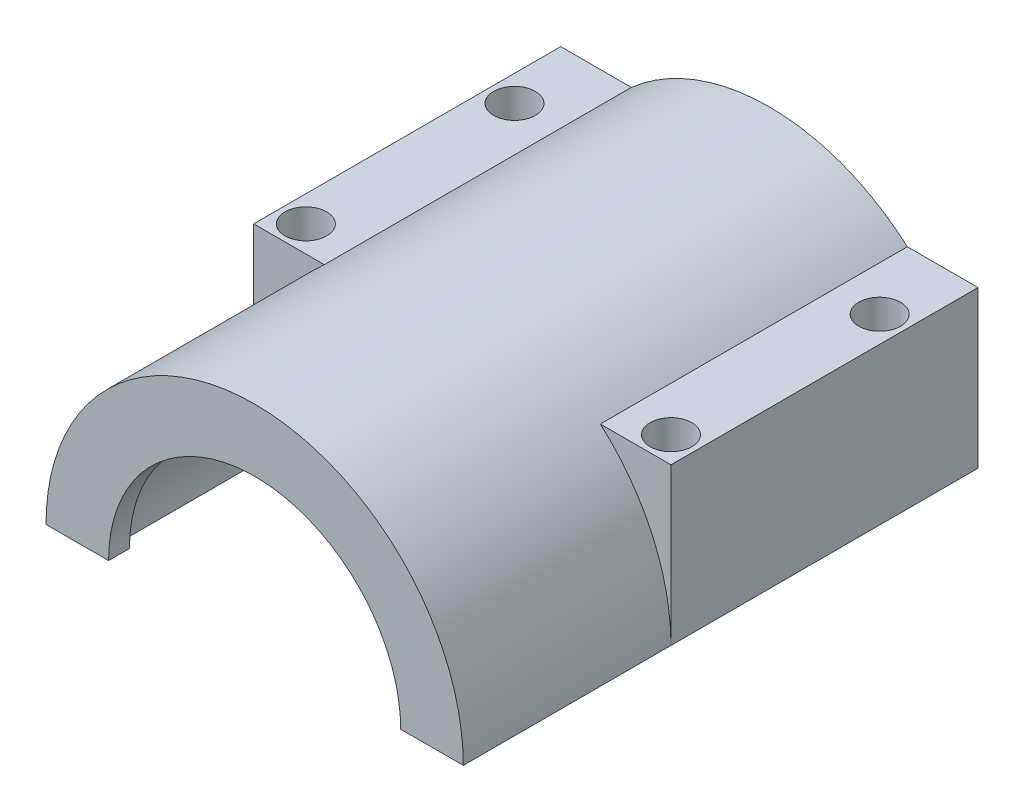
ISO-10303-21;
HEADER;
FILE_DESCRIPTION(('STEP AP214'),'2;1');
FILE_NAME('part.step','',(''),(''),'','','');
FILE_SCHEMA(('AUTOMOTIVE_DESIGN { 1 0 10303 214 1 1 1 1 }'));
ENDSEC;
DATA;
#1=APPLICATION_CONTEXT('core data for automotive mechanical design processes');
#2=APPLICATION_PROTOCOL_DEFINITION('international standard','automotive_design',2000,#1);
#3=PRODUCT_CONTEXT('',#1,'mechanical');
#4=PRODUCT('Part','Part','',(#3));
#5=PRODUCT_RELATED_PRODUCT_CATEGORY('part','',(#4));
#6=PRODUCT_DEFINITION_FORMATION('','',#4);
#7=PRODUCT_DEFINITION_CONTEXT('part definition',#1,'design');
#8=PRODUCT_DEFINITION('design','',#6,#7);
#9=PRODUCT_DEFINITION_SHAPE('','',#8);
#10=(LENGTH_UNIT() NAMED_UNIT(*) SI_UNIT(.MILLI.,.METRE.));
#11=(NAMED_UNIT(*) PLANE_ANGLE_UNIT() SI_UNIT($,.RADIAN.));
#12=(NAMED_UNIT(*) SI_UNIT($,.STERADIAN.) SOLID_ANGLE_UNIT());
#13=UNCERTAINTY_MEASURE_WITH_UNIT(LENGTH_MEASURE(1.E-05),#10,'distance_accuracy_value','');
#14=(GEOMETRIC_REPRESENTATION_CONTEXT(3) GLOBAL_UNCERTAINTY_ASSIGNED_CONTEXT((#13)) GLOBAL_UNIT_ASSIGNED_CONTEXT((#10,
#11,#12)) REPRESENTATION_CONTEXT('',''));
#15=CARTESIAN_POINT('',(0.,0.,0.));
#16=DIRECTION('',(0.,0.,1.));
#17=DIRECTION('',(1.,0.,0.));
#18=AXIS2_PLACEMENT_3D('',#15,#16,#17);
#19=CARTESIAN_POINT('',(0.,0.,52.578));
#20=DIRECTION('',(0.,0.,-1.));
#21=DIRECTION('',(-1.,0.,0.));
#22=AXIS2_PLACEMENT_3D('',#19,#20,#21);
#23=CYLINDRICAL_SURFACE('',#22,25.4);
#24=CARTESIAN_POINT('',(0.,0.,32.375));
#25=DIRECTION('',(0.,0.,-1.));
#26=DIRECTION('',(-1.,0.,0.));
#27=AXIS2_PLACEMENT_3D('',#24,#25,#26);
#28=CIRCLE('',#27,25.4);
#29=CARTESIAN_POINT('',(-16.8005208252601,19.05,32.375));
#30=VERTEX_POINT('',#29);
#31=CARTESIAN_POINT('',(-25.4,0.,32.375));
#32=VERTEX_POINT('',#31);
#33=EDGE_CURVE('E149',#30,#32,#28,.F.);
#34=ORIENTED_EDGE('',*,*,#33,.T.);
#35=DIRECTION('',(0.,0.,-1.));
#36=VECTOR('',#35,1.);
#37=CARTESIAN_POINT('',(-25.4,0.,52.578));
#38=LINE('',#37,#36);
#39=CARTESIAN_POINT('',(-25.4,0.,57.658));
#40=VERTEX_POINT('',#39);
#41=EDGE_CURVE('E144',#40,#32,#38,.T.);
#42=ORIENTED_EDGE('',*,*,#41,.F.);
#43=CARTESIAN_POINT('',(0.,0.,57.658));
#44=DIRECTION('',(0.,0.,1.));
#45=DIRECTION('',(1.,0.,0.));
#46=AXIS2_PLACEMENT_3D('',#43,#44,#45);
#47=CIRCLE('',#46,25.4);
#48=CARTESIAN_POINT('',(25.4,0.,57.658));
#49=VERTEX_POINT('',#48);
#50=EDGE_CURVE('E148',#49,#40,#47,.T.);
#51=ORIENTED_EDGE('',*,*,#50,.F.);
#52=DIRECTION('',(0.,0.,-1.));
#53=VECTOR('',#52,1.);
#54=CARTESIAN_POINT('',(25.4,0.,52.578));
#55=LINE('',#54,#53);
#56=CARTESIAN_POINT('',(25.4,0.,32.375));
#57=VERTEX_POINT('',#56);
#58=EDGE_CURVE('E56',#49,#57,#55,.T.);
#59=ORIENTED_EDGE('',*,*,#58,.T.);
#60=CARTESIAN_POINT('',(0.,0.,32.375));
#61=DIRECTION('',(0.,0.,1.));
#62=DIRECTION('',(1.,0.,0.));
#63=AXIS2_PLACEMENT_3D('',#60,#61,#62);
#64=CIRCLE('',#63,25.4);
#65=CARTESIAN_POINT('',(16.8005208252601,19.05,32.375));
#66=VERTEX_POINT('',#65);
#67=EDGE_CURVE('E224',#66,#57,#64,.F.);
#68=ORIENTED_EDGE('',*,*,#67,.F.);
#69=DIRECTION('',(0.,0.,-1.));
#70=VECTOR('',#69,1.);
#71=CARTESIAN_POINT('',(16.8005208252601,19.05,52.578));
#72=LINE('',#71,#70);
#73=CARTESIAN_POINT('',(16.8005208252601,19.05,-5.));
#74=VERTEX_POINT('',#73);
#75=EDGE_CURVE('E219',#66,#74,#72,.T.);
#76=ORIENTED_EDGE('',*,*,#75,.T.);
#77=CARTESIAN_POINT('',(0.,0.,-5.));
#78=DIRECTION('',(0.,0.,-1.));
#79=DIRECTION('',(-1.,0.,0.));
#80=AXIS2_PLACEMENT_3D('',#77,#78,#79);
#81=CIRCLE('',#80,25.4);
#82=CARTESIAN_POINT('',(-16.8005208252601,19.05,-5.));
#83=VERTEX_POINT('',#82);
#84=EDGE_CURVE('E286',#83,#74,#81,.T.);
#85=ORIENTED_EDGE('',*,*,#84,.F.);
#86=DIRECTION('',(0.,0.,-1.));
#87=VECTOR('',#86,1.);
#88=CARTESIAN_POINT('',(-16.8005208252601,19.05,52.578));
#89=LINE('',#88,#87);
#90=EDGE_CURVE('E63',#83,#30,#89,.F.);
#91=ORIENTED_EDGE('',*,*,#90,.T.);
#92=EDGE_LOOP('',(#34,#42,#51,#59,#68,#76,#85,#91));
#93=FACE_BOUND('',#92,.T.);
#94=ADVANCED_FACE('F47',(#93),#23,.T.);
#95=CARTESIAN_POINT('',(0.,0.,52.578));
#96=DIRECTION('',(0.,0.,-1.));
#97=DIRECTION('',(-1.,0.,0.));
#98=AXIS2_PLACEMENT_3D('',#95,#96,#97);
#99=CYLINDRICAL_SURFACE('',#98,19.05);
#100=CARTESIAN_POINT('',(0.,0.,0.));
#101=DIRECTION('',(0.,0.,-1.));
#102=DIRECTION('',(1.,0.,0.));
#103=AXIS2_PLACEMENT_3D('',#100,#101,#102);
#104=CIRCLE('',#103,19.05);
#105=CARTESIAN_POINT('',(-19.05,0.,0.));
#106=VERTEX_POINT('',#105);
#107=CARTESIAN_POINT('',(19.05,0.,0.));
#108=VERTEX_POINT('',#107);
#109=EDGE_CURVE('E309',#106,#108,#104,.T.);
#110=ORIENTED_EDGE('',*,*,#109,.T.);
#111=DIRECTION('',(0.,0.,-1.));
#112=VECTOR('',#111,1.);
#113=CARTESIAN_POINT('',(19.05,0.,52.578));
#114=LINE('',#113,#112);
#115=CARTESIAN_POINT('',(19.05,0.,55.118));
#116=VERTEX_POINT('',#115);
#117=EDGE_CURVE('E12',#116,#108,#114,.T.);
#118=ORIENTED_EDGE('',*,*,#117,.F.);
#119=CARTESIAN_POINT('',(0.,0.,55.118));
#120=DIRECTION('',(0.,0.,-1.));
#121=DIRECTION('',(1.,0.,0.));
#122=AXIS2_PLACEMENT_3D('',#119,#120,#121);
#123=CIRCLE('',#122,19.05);
#124=CARTESIAN_POINT('',(-19.05,0.,55.118));
#125=VERTEX_POINT('',#124);
#126=EDGE_CURVE('E192',#125,#116,#123,.T.);
#127=ORIENTED_EDGE('',*,*,#126,.F.);
#128=DIRECTION('',(0.,0.,-1.));
#129=VECTOR('',#128,1.);
#130=CARTESIAN_POINT('',(-19.05,0.,52.578));
#131=LINE('',#130,#129);
#132=EDGE_CURVE('E313',#125,#106,#131,.T.);
#133=ORIENTED_EDGE('',*,*,#132,.T.);
#134=EDGE_LOOP('',(#110,#118,#127,#133));
#135=FACE_BOUND('',#134,.T.);
#136=ADVANCED_FACE('F49',(#135),#99,.F.);
#137=CARTESIAN_POINT('',(19.05,0.,52.578));
#138=DIRECTION('',(0.,1.,0.));
#139=DIRECTION('',(0.,0.,1.));
#140=AXIS2_PLACEMENT_3D('',#137,#138,#139);
#141=PLANE('',#140);
#142=ORIENTED_EDGE('',*,*,#117,.T.);
#143=DIRECTION('',(-1.,0.,0.));
#144=VECTOR('',#143,1.);
#145=CARTESIAN_POINT('',(25.4,0.,0.));
#146=LINE('',#145,#144);
#147=CARTESIAN_POINT('',(13.,0.,0.));
#148=VERTEX_POINT('',#147);
#149=EDGE_CURVE('E282',#108,#148,#146,.T.);
#150=ORIENTED_EDGE('',*,*,#149,.T.);
#151=DIRECTION('',(0.,0.,1.));
#152=VECTOR('',#151,1.);
#153=CARTESIAN_POINT('',(13.,0.,-5.));
#154=LINE('',#153,#152);
#155=CARTESIAN_POINT('',(13.,0.,-5.));
#156=VERTEX_POINT('',#155);
#157=EDGE_CURVE('E292',#156,#148,#154,.T.);
#158=ORIENTED_EDGE('',*,*,#157,.F.);
#159=DIRECTION('',(-1.,0.,0.));
#160=VECTOR('',#159,1.);
#161=CARTESIAN_POINT('',(25.4,0.,-5.));
#162=LINE('',#161,#160);
#163=CARTESIAN_POINT('',(25.4,0.,-5.));
#164=VERTEX_POINT('',#163);
#165=EDGE_CURVE('E289',#164,#156,#162,.T.);
#166=ORIENTED_EDGE('',*,*,#165,.F.);
#167=EDGE_CURVE('E152',#57,#164,#55,.T.);
#168=ORIENTED_EDGE('',*,*,#167,.F.);
#169=ORIENTED_EDGE('',*,*,#58,.F.);
#170=DIRECTION('',(1.,0.,0.));
#171=VECTOR('',#170,1.);
#172=CARTESIAN_POINT('',(17.78,0.,57.658));
#173=LINE('',#172,#171);
#174=CARTESIAN_POINT('',(17.78,0.,57.658));
#175=VERTEX_POINT('',#174);
#176=EDGE_CURVE('E169',#175,#49,#173,.T.);
#177=ORIENTED_EDGE('',*,*,#176,.F.);
#178=DIRECTION('',(0.,0.,-1.));
#179=VECTOR('',#178,1.);
#180=CARTESIAN_POINT('',(17.78,0.,57.658));
#181=LINE('',#180,#179);
#182=CARTESIAN_POINT('',(17.78,0.,55.118));
#183=VERTEX_POINT('',#182);
#184=EDGE_CURVE('E181',#175,#183,#181,.T.);
#185=ORIENTED_EDGE('',*,*,#184,.T.);
#186=DIRECTION('',(1.,0.,0.));
#187=VECTOR('',#186,1.);
#188=CARTESIAN_POINT('',(17.78,0.,55.118));
#189=LINE('',#188,#187);
#190=EDGE_CURVE('E171',#183,#116,#189,.T.);
#191=ORIENTED_EDGE('',*,*,#190,.T.);
#192=EDGE_LOOP('',(#142,#150,#158,#166,#168,#169,#177,#185,#191));
#193=FACE_BOUND('',#192,.T.);
#194=CARTESIAN_POINT('',(22.225,0.,29.2));
#195=DIRECTION('',(0.,1.,0.));
#196=DIRECTION('',(0.,0.,1.));
#197=AXIS2_PLACEMENT_3D('',#194,#195,#196);
#198=CIRCLE('',#197,2.54);
#199=CARTESIAN_POINT('',(22.225,0.,31.74));
#200=VERTEX_POINT('',#199);
#201=EDGE_CURVE('E266',#200,#200,#198,.T.);
#202=ORIENTED_EDGE('',*,*,#201,.T.);
#203=EDGE_LOOP('',(#202));
#204=FACE_BOUND('',#203,.T.);
#205=CARTESIAN_POINT('',(22.225,0.,3.8));
#206=DIRECTION('',(0.,1.,0.));
#207=DIRECTION('',(0.,0.,1.));
#208=AXIS2_PLACEMENT_3D('',#205,#206,#207);
#209=CIRCLE('',#208,2.54);
#210=CARTESIAN_POINT('',(22.225,0.,6.34));
#211=VERTEX_POINT('',#210);
#212=EDGE_CURVE('E261',#211,#211,#209,.T.);
#213=ORIENTED_EDGE('',*,*,#212,.T.);
#214=EDGE_LOOP('',(#213));
#215=FACE_BOUND('',#214,.T.);
#216=ADVANCED_FACE('F327',(#193,#204,#215),#141,.F.);
#217=CARTESIAN_POINT('',(-19.05,0.,52.578));
#218=DIRECTION('',(0.,1.,0.));
#219=DIRECTION('',(0.,0.,1.));
#220=AXIS2_PLACEMENT_3D('',#217,#218,#219);
#221=PLANE('',#220);
#222=ORIENTED_EDGE('',*,*,#41,.T.);
#223=CARTESIAN_POINT('',(-25.4,0.,-4.99999999999999));
#224=VERTEX_POINT('',#223);
#225=EDGE_CURVE('E153',#32,#224,#38,.T.);
#226=ORIENTED_EDGE('',*,*,#225,.T.);
#227=DIRECTION('',(-1.,0.,0.));
#228=VECTOR('',#227,1.);
#229=CARTESIAN_POINT('',(0.999999999999998,0.,-5.));
#230=LINE('',#229,#228);
#231=CARTESIAN_POINT('',(0.999999999999998,0.,-5.));
#232=VERTEX_POINT('',#231);
#233=EDGE_CURVE('E281',#232,#224,#230,.T.);
#234=ORIENTED_EDGE('',*,*,#233,.F.);
#235=DIRECTION('',(0.,0.,1.));
#236=VECTOR('',#235,1.);
#237=CARTESIAN_POINT('',(0.999999999999998,0.,-5.));
#238=LINE('',#237,#236);
#239=CARTESIAN_POINT('',(0.999999999999998,0.,0.));
#240=VERTEX_POINT('',#239);
#241=EDGE_CURVE('E305',#232,#240,#238,.T.);
#242=ORIENTED_EDGE('',*,*,#241,.T.);
#243=DIRECTION('',(-1.,0.,0.));
#244=VECTOR('',#243,1.);
#245=CARTESIAN_POINT('',(0.999999999999998,0.,0.));
#246=LINE('',#245,#244);
#247=EDGE_CURVE('E296',#240,#106,#246,.T.);
#248=ORIENTED_EDGE('',*,*,#247,.T.);
#249=ORIENTED_EDGE('',*,*,#132,.F.);
#250=DIRECTION('',(1.,0.,0.));
#251=VECTOR('',#250,1.);
#252=CARTESIAN_POINT('',(-17.78,0.,55.118));
#253=LINE('',#252,#251);
#254=CARTESIAN_POINT('',(-17.78,0.,55.118));
#255=VERTEX_POINT('',#254);
#256=EDGE_CURVE('E182',#125,#255,#253,.T.);
#257=ORIENTED_EDGE('',*,*,#256,.T.);
#258=DIRECTION('',(0.,0.,-1.));
#259=VECTOR('',#258,1.);
#260=CARTESIAN_POINT('',(-17.78,0.,57.658));
#261=LINE('',#260,#259);
#262=CARTESIAN_POINT('',(-17.78,0.,57.658));
#263=VERTEX_POINT('',#262);
#264=EDGE_CURVE('E160',#263,#255,#261,.T.);
#265=ORIENTED_EDGE('',*,*,#264,.F.);
#266=DIRECTION('',(1.,0.,0.));
#267=VECTOR('',#266,1.);
#268=CARTESIAN_POINT('',(-17.78,0.,57.658));
#269=LINE('',#268,#267);
#270=EDGE_CURVE('E156',#40,#263,#269,.T.);
#271=ORIENTED_EDGE('',*,*,#270,.F.);
#272=EDGE_LOOP('',(#222,#226,#234,#242,#248,#249,#257,#265,#271));
#273=FACE_BOUND('',#272,.T.);
#274=CARTESIAN_POINT('',(-22.225,0.,29.2));
#275=DIRECTION('',(0.,1.,0.));
#276=DIRECTION('',(0.,0.,1.));
#277=AXIS2_PLACEMENT_3D('',#274,#275,#276);
#278=CIRCLE('',#277,2.54);
#279=CARTESIAN_POINT('',(-22.225,0.,31.74));
#280=VERTEX_POINT('',#279);
#281=EDGE_CURVE('E260',#280,#280,#278,.T.);
#282=ORIENTED_EDGE('',*,*,#281,.T.);
#283=EDGE_LOOP('',(#282));
#284=FACE_BOUND('',#283,.T.);
#285=CARTESIAN_POINT('',(-22.225,0.,3.8));
#286=DIRECTION('',(0.,1.,0.));
#287=DIRECTION('',(0.,0.,1.));
#288=AXIS2_PLACEMENT_3D('',#285,#286,#287);
#289=CIRCLE('',#288,2.54);
#290=CARTESIAN_POINT('',(-22.225,0.,6.34));
#291=VERTEX_POINT('',#290);
#292=EDGE_CURVE('E265',#291,#291,#289,.T.);
#293=ORIENTED_EDGE('',*,*,#292,.T.);
#294=EDGE_LOOP('',(#293));
#295=FACE_BOUND('',#294,.T.);
#296=ADVANCED_FACE('F157',(#273,#284,#295),#221,.F.);
#297=CARTESIAN_POINT('',(7.,0.,0.));
#298=DIRECTION('',(0.,0.,-1.));
#299=DIRECTION('',(-1.,0.,0.));
#300=AXIS2_PLACEMENT_3D('',#297,#298,#299);
#301=PLANE('',#300);
#302=ORIENTED_EDGE('',*,*,#109,.F.);
#303=ORIENTED_EDGE('',*,*,#247,.F.);
#304=CARTESIAN_POINT('',(7.,0.,0.));
#305=DIRECTION('',(0.,0.,1.));
#306=DIRECTION('',(-1.,0.,0.));
#307=AXIS2_PLACEMENT_3D('',#304,#305,#306);
#308=CIRCLE('',#307,6.);
#309=EDGE_CURVE('E276',#148,#240,#308,.T.);
#310=ORIENTED_EDGE('',*,*,#309,.F.);
#311=ORIENTED_EDGE('',*,*,#149,.F.);
#312=EDGE_LOOP('',(#302,#303,#310,#311));
#313=FACE_BOUND('',#312,.T.);
#314=ADVANCED_FACE('F367',(#313),#301,.F.);
#315=CARTESIAN_POINT('',(7.,0.,-5.));
#316=DIRECTION('',(0.,0.,1.));
#317=DIRECTION('',(1.,0.,0.));
#318=AXIS2_PLACEMENT_3D('',#315,#316,#317);
#319=CYLINDRICAL_SURFACE('',#318,6.);
#320=ORIENTED_EDGE('',*,*,#309,.T.);
#321=ORIENTED_EDGE('',*,*,#241,.F.);
#322=CARTESIAN_POINT('',(7.,0.,-5.));
#323=DIRECTION('',(0.,0.,1.));
#324=DIRECTION('',(-1.,0.,0.));
#325=AXIS2_PLACEMENT_3D('',#322,#323,#324);
#326=CIRCLE('',#325,6.);
#327=EDGE_CURVE('E277',#156,#232,#326,.T.);
#328=ORIENTED_EDGE('',*,*,#327,.F.);
#329=ORIENTED_EDGE('',*,*,#157,.T.);
#330=EDGE_LOOP('',(#320,#321,#328,#329));
#331=FACE_BOUND('',#330,.T.);
#332=ADVANCED_FACE('F333',(#331),#319,.F.);
#333=CARTESIAN_POINT('',(7.,0.,-5.));
#334=DIRECTION('',(0.,0.,-1.));
#335=DIRECTION('',(-1.,0.,0.));
#336=AXIS2_PLACEMENT_3D('',#333,#334,#335);
#337=PLANE('',#336);
#338=ORIENTED_EDGE('',*,*,#327,.T.);
#339=ORIENTED_EDGE('',*,*,#233,.T.);
#340=DIRECTION('',(0.,1.,0.));
#341=VECTOR('',#340,1.);
#342=CARTESIAN_POINT('',(-25.4,-19.3023288750347,-5.));
#343=LINE('',#342,#341);
#344=CARTESIAN_POINT('',(-25.4,19.05,-5.));
#345=VERTEX_POINT('',#344);
#346=EDGE_CURVE('E210',#224,#345,#343,.T.);
#347=ORIENTED_EDGE('',*,*,#346,.T.);
#348=DIRECTION('',(1.,0.,0.));
#349=VECTOR('',#348,1.);
#350=CARTESIAN_POINT('',(-16.51,19.05,-5.));
#351=LINE('',#350,#349);
#352=EDGE_CURVE('E200',#345,#83,#351,.T.);
#353=ORIENTED_EDGE('',*,*,#352,.T.);
#354=ORIENTED_EDGE('',*,*,#84,.T.);
#355=DIRECTION('',(-1.,0.,0.));
#356=VECTOR('',#355,1.);
#357=CARTESIAN_POINT('',(16.51,19.05,-5.));
#358=LINE('',#357,#356);
#359=CARTESIAN_POINT('',(25.4,19.05,-5.));
#360=VERTEX_POINT('',#359);
#361=EDGE_CURVE('E234',#360,#74,#358,.T.);
#362=ORIENTED_EDGE('',*,*,#361,.F.);
#363=DIRECTION('',(0.,1.,0.));
#364=VECTOR('',#363,1.);
#365=CARTESIAN_POINT('',(25.4,-19.3023288750347,-5.));
#366=LINE('',#365,#364);
#367=EDGE_CURVE('E228',#164,#360,#366,.T.);
#368=ORIENTED_EDGE('',*,*,#367,.F.);
#369=ORIENTED_EDGE('',*,*,#165,.T.);
#370=EDGE_LOOP('',(#338,#339,#347,#353,#354,#362,#368,#369));
#371=FACE_BOUND('',#370,.T.);
#372=ADVANCED_FACE('F325',(#371),#337,.T.);
#373=CARTESIAN_POINT('',(-22.225,25.4,3.8));
#374=DIRECTION('',(0.,-1.,0.));
#375=DIRECTION('',(0.,0.,-1.));
#376=AXIS2_PLACEMENT_3D('',#373,#374,#375);
#377=CYLINDRICAL_SURFACE('',#376,2.54);
#378=ORIENTED_EDGE('',*,*,#292,.F.);
#379=EDGE_LOOP('',(#378));
#380=FACE_BOUND('',#379,.T.);
#381=CARTESIAN_POINT('',(-22.225,19.05,3.8));
#382=DIRECTION('',(0.,-1.,0.));
#383=DIRECTION('',(0.,0.,-1.));
#384=AXIS2_PLACEMENT_3D('',#381,#382,#383);
#385=CIRCLE('',#384,2.54);
#386=CARTESIAN_POINT('',(-22.225,19.05,1.26));
#387=VERTEX_POINT('',#386);
#388=EDGE_CURVE('E245',#387,#387,#385,.T.);
#389=ORIENTED_EDGE('',*,*,#388,.F.);
#390=EDGE_LOOP('',(#389));
#391=FACE_BOUND('',#390,.T.);
#392=ADVANCED_FACE('F381',(#380,#391),#377,.F.);
#393=CARTESIAN_POINT('',(-22.225,25.4,29.2));
#394=DIRECTION('',(0.,-1.,0.));
#395=DIRECTION('',(0.,0.,-1.));
#396=AXIS2_PLACEMENT_3D('',#393,#394,#395);
#397=CYLINDRICAL_SURFACE('',#396,2.54);
#398=ORIENTED_EDGE('',*,*,#281,.F.);
#399=EDGE_LOOP('',(#398));
#400=FACE_BOUND('',#399,.T.);
#401=CARTESIAN_POINT('',(-22.225,19.05,29.2));
#402=DIRECTION('',(0.,-1.,0.));
#403=DIRECTION('',(0.,0.,-1.));
#404=AXIS2_PLACEMENT_3D('',#401,#402,#403);
#405=CIRCLE('',#404,2.54);
#406=CARTESIAN_POINT('',(-22.225,19.05,26.66));
#407=VERTEX_POINT('',#406);
#408=EDGE_CURVE('E249',#407,#407,#405,.T.);
#409=ORIENTED_EDGE('',*,*,#408,.F.);
#410=EDGE_LOOP('',(#409));
#411=FACE_BOUND('',#410,.T.);
#412=ADVANCED_FACE('F384',(#400,#411),#397,.F.);
#413=CARTESIAN_POINT('',(22.225,25.4,3.8));
#414=DIRECTION('',(0.,-1.,0.));
#415=DIRECTION('',(0.,0.,-1.));
#416=AXIS2_PLACEMENT_3D('',#413,#414,#415);
#417=CYLINDRICAL_SURFACE('',#416,2.54);
#418=ORIENTED_EDGE('',*,*,#212,.F.);
#419=EDGE_LOOP('',(#418));
#420=FACE_BOUND('',#419,.T.);
#421=CARTESIAN_POINT('',(22.225,19.05,3.8));
#422=DIRECTION('',(0.,-1.,0.));
#423=DIRECTION('',(0.,0.,-1.));
#424=AXIS2_PLACEMENT_3D('',#421,#422,#423);
#425=CIRCLE('',#424,2.54);
#426=CARTESIAN_POINT('',(22.225,19.05,1.26));
#427=VERTEX_POINT('',#426);
#428=EDGE_CURVE('E250',#427,#427,#425,.T.);
#429=ORIENTED_EDGE('',*,*,#428,.F.);
#430=EDGE_LOOP('',(#429));
#431=FACE_BOUND('',#430,.T.);
#432=ADVANCED_FACE('F388',(#420,#431),#417,.F.);
#433=CARTESIAN_POINT('',(22.225,25.4,29.2));
#434=DIRECTION('',(0.,-1.,0.));
#435=DIRECTION('',(0.,0.,-1.));
#436=AXIS2_PLACEMENT_3D('',#433,#434,#435);
#437=CYLINDRICAL_SURFACE('',#436,2.54);
#438=ORIENTED_EDGE('',*,*,#201,.F.);
#439=EDGE_LOOP('',(#438));
#440=FACE_BOUND('',#439,.T.);
#441=CARTESIAN_POINT('',(22.225,19.05,29.2));
#442=DIRECTION('',(0.,-1.,0.));
#443=DIRECTION('',(0.,0.,-1.));
#444=AXIS2_PLACEMENT_3D('',#441,#442,#443);
#445=CIRCLE('',#444,2.54);
#446=CARTESIAN_POINT('',(22.225,19.05,26.66));
#447=VERTEX_POINT('',#446);
#448=EDGE_CURVE('E223',#447,#447,#445,.T.);
#449=ORIENTED_EDGE('',*,*,#448,.F.);
#450=EDGE_LOOP('',(#449));
#451=FACE_BOUND('',#450,.T.);
#452=ADVANCED_FACE('F390',(#440,#451),#437,.F.);
#453=CARTESIAN_POINT('',(-22.225,19.05,3.8));
#454=DIRECTION('',(0.,-1.,0.));
#455=DIRECTION('',(0.,0.,-1.));
#456=AXIS2_PLACEMENT_3D('',#453,#454,#455);
#457=PLANE('',#456);
#458=ORIENTED_EDGE('',*,*,#388,.T.);
#459=EDGE_LOOP('',(#458));
#460=FACE_BOUND('',#459,.T.);
#461=ORIENTED_EDGE('',*,*,#352,.F.);
#462=DIRECTION('',(0.,0.,-1.));
#463=VECTOR('',#462,1.);
#464=CARTESIAN_POINT('',(-25.4,19.05,32.375));
#465=LINE('',#464,#463);
#466=CARTESIAN_POINT('',(-25.4,19.05,32.375));
#467=VERTEX_POINT('',#466);
#468=EDGE_CURVE('E203',#467,#345,#465,.T.);
#469=ORIENTED_EDGE('',*,*,#468,.F.);
#470=DIRECTION('',(-1.,0.,0.));
#471=VECTOR('',#470,1.);
#472=CARTESIAN_POINT('',(-16.51,19.05,32.375));
#473=LINE('',#472,#471);
#474=EDGE_CURVE('E206',#30,#467,#473,.T.);
#475=ORIENTED_EDGE('',*,*,#474,.F.);
#476=ORIENTED_EDGE('',*,*,#90,.F.);
#477=EDGE_LOOP('',(#461,#469,#475,#476));
#478=FACE_BOUND('',#477,.T.);
#479=ORIENTED_EDGE('',*,*,#408,.T.);
#480=EDGE_LOOP('',(#479));
#481=FACE_BOUND('',#480,.T.);
#482=ADVANCED_FACE('F339',(#460,#478,#481),#457,.F.);
#483=CARTESIAN_POINT('',(22.225,19.05,29.2));
#484=DIRECTION('',(0.,-1.,0.));
#485=DIRECTION('',(0.,0.,-1.));
#486=AXIS2_PLACEMENT_3D('',#483,#484,#485);
#487=PLANE('',#486);
#488=ORIENTED_EDGE('',*,*,#448,.T.);
#489=EDGE_LOOP('',(#488));
#490=FACE_BOUND('',#489,.T.);
#491=ORIENTED_EDGE('',*,*,#75,.F.);
#492=DIRECTION('',(1.,0.,0.));
#493=VECTOR('',#492,1.);
#494=CARTESIAN_POINT('',(16.51,19.05,32.375));
#495=LINE('',#494,#493);
#496=CARTESIAN_POINT('',(25.4,19.05,32.375));
#497=VERTEX_POINT('',#496);
#498=EDGE_CURVE('E215',#66,#497,#495,.T.);
#499=ORIENTED_EDGE('',*,*,#498,.T.);
#500=DIRECTION('',(0.,0.,-1.));
#501=VECTOR('',#500,1.);
#502=CARTESIAN_POINT('',(25.4,19.05,32.375));
#503=LINE('',#502,#501);
#504=EDGE_CURVE('E231',#497,#360,#503,.T.);
#505=ORIENTED_EDGE('',*,*,#504,.T.);
#506=ORIENTED_EDGE('',*,*,#361,.T.);
#507=EDGE_LOOP('',(#491,#499,#505,#506));
#508=FACE_BOUND('',#507,.T.);
#509=ORIENTED_EDGE('',*,*,#428,.T.);
#510=EDGE_LOOP('',(#509));
#511=FACE_BOUND('',#510,.T.);
#512=ADVANCED_FACE('F397',(#490,#508,#511),#487,.F.);
#513=CARTESIAN_POINT('',(16.51,-19.3023288750347,32.375));
#514=DIRECTION('',(0.,0.,1.));
#515=DIRECTION('',(1.,0.,0.));
#516=AXIS2_PLACEMENT_3D('',#513,#514,#515);
#517=PLANE('',#516);
#518=ORIENTED_EDGE('',*,*,#498,.F.);
#519=ORIENTED_EDGE('',*,*,#67,.T.);
#520=DIRECTION('',(0.,1.,0.));
#521=VECTOR('',#520,1.);
#522=CARTESIAN_POINT('',(25.4,-19.3023288750347,32.375));
#523=LINE('',#522,#521);
#524=EDGE_CURVE('E238',#57,#497,#523,.T.);
#525=ORIENTED_EDGE('',*,*,#524,.T.);
#526=EDGE_LOOP('',(#518,#519,#525));
#527=FACE_BOUND('',#526,.T.);
#528=ADVANCED_FACE('F352',(#527),#517,.T.);
#529=CARTESIAN_POINT('',(25.4,-19.3023288750347,32.375));
#530=DIRECTION('',(1.,0.,0.));
#531=DIRECTION('',(0.,0.,-1.));
#532=AXIS2_PLACEMENT_3D('',#529,#530,#531);
#533=PLANE('',#532);
#534=ORIENTED_EDGE('',*,*,#367,.T.);
#535=ORIENTED_EDGE('',*,*,#504,.F.);
#536=ORIENTED_EDGE('',*,*,#524,.F.);
#537=ORIENTED_EDGE('',*,*,#167,.T.);
#538=EDGE_LOOP('',(#534,#535,#536,#537));
#539=FACE_BOUND('',#538,.T.);
#540=ADVANCED_FACE('F320',(#539),#533,.T.);
#541=CARTESIAN_POINT('',(-16.51,-19.3023288750347,32.375));
#542=DIRECTION('',(0.,0.,-1.));
#543=DIRECTION('',(-1.,0.,0.));
#544=AXIS2_PLACEMENT_3D('',#541,#542,#543);
#545=PLANE('',#544);
#546=ORIENTED_EDGE('',*,*,#33,.F.);
#547=ORIENTED_EDGE('',*,*,#474,.T.);
#548=DIRECTION('',(0.,1.,0.));
#549=VECTOR('',#548,1.);
#550=CARTESIAN_POINT('',(-25.4,-19.3023288750347,32.375));
#551=LINE('',#550,#549);
#552=EDGE_CURVE('E211',#32,#467,#551,.T.);
#553=ORIENTED_EDGE('',*,*,#552,.F.);
#554=EDGE_LOOP('',(#546,#547,#553));
#555=FACE_BOUND('',#554,.T.);
#556=ADVANCED_FACE('F342',(#555),#545,.F.);
#557=CARTESIAN_POINT('',(-25.4,-19.3023288750347,32.375));
#558=DIRECTION('',(1.,0.,0.));
#559=DIRECTION('',(0.,0.,-1.));
#560=AXIS2_PLACEMENT_3D('',#557,#558,#559);
#561=PLANE('',#560);
#562=ORIENTED_EDGE('',*,*,#225,.F.);
#563=ORIENTED_EDGE('',*,*,#552,.T.);
#564=ORIENTED_EDGE('',*,*,#468,.T.);
#565=ORIENTED_EDGE('',*,*,#346,.F.);
#566=EDGE_LOOP('',(#562,#563,#564,#565));
#567=FACE_BOUND('',#566,.T.);
#568=ADVANCED_FACE('F338',(#567),#561,.F.);
#569=CARTESIAN_POINT('',(0.,0.,55.118));
#570=DIRECTION('',(0.,0.,1.));
#571=DIRECTION('',(1.,0.,0.));
#572=AXIS2_PLACEMENT_3D('',#569,#570,#571);
#573=PLANE('',#572);
#574=ORIENTED_EDGE('',*,*,#256,.F.);
#575=ORIENTED_EDGE('',*,*,#126,.T.);
#576=ORIENTED_EDGE('',*,*,#190,.F.);
#577=CARTESIAN_POINT('',(0.,0.,55.118));
#578=DIRECTION('',(0.,0.,-1.));
#579=DIRECTION('',(1.,0.,0.));
#580=AXIS2_PLACEMENT_3D('',#577,#578,#579);
#581=CIRCLE('',#580,17.78);
#582=EDGE_CURVE('E174',#255,#183,#581,.T.);
#583=ORIENTED_EDGE('',*,*,#582,.F.);
#584=EDGE_LOOP('',(#574,#575,#576,#583));
#585=FACE_BOUND('',#584,.T.);
#586=ADVANCED_FACE('F349',(#585),#573,.F.);
#587=CARTESIAN_POINT('',(0.,0.,57.658));
#588=DIRECTION('',(0.,0.,-1.));
#589=DIRECTION('',(-1.,0.,0.));
#590=AXIS2_PLACEMENT_3D('',#587,#588,#589);
#591=CYLINDRICAL_SURFACE('',#590,17.78);
#592=ORIENTED_EDGE('',*,*,#582,.T.);
#593=ORIENTED_EDGE('',*,*,#184,.F.);
#594=CARTESIAN_POINT('',(0.,0.,57.658));
#595=DIRECTION('',(0.,0.,-1.));
#596=DIRECTION('',(1.,0.,0.));
#597=AXIS2_PLACEMENT_3D('',#594,#595,#596);
#598=CIRCLE('',#597,17.78);
#599=EDGE_CURVE('E164',#263,#175,#598,.T.);
#600=ORIENTED_EDGE('',*,*,#599,.F.);
#601=ORIENTED_EDGE('',*,*,#264,.T.);
#602=EDGE_LOOP('',(#592,#593,#600,#601));
#603=FACE_BOUND('',#602,.T.);
#604=ADVANCED_FACE('F499',(#603),#591,.F.);
#605=CARTESIAN_POINT('',(0.,0.,57.658));
#606=DIRECTION('',(0.,0.,1.));
#607=DIRECTION('',(1.,0.,0.));
#608=AXIS2_PLACEMENT_3D('',#605,#606,#607);
#609=PLANE('',#608);
#610=ORIENTED_EDGE('',*,*,#50,.T.);
#611=ORIENTED_EDGE('',*,*,#270,.T.);
#612=ORIENTED_EDGE('',*,*,#599,.T.);
#613=ORIENTED_EDGE('',*,*,#176,.T.);
#614=EDGE_LOOP('',(#610,#611,#612,#613));
#615=FACE_BOUND('',#614,.T.);
#616=ADVANCED_FACE('F167',(#615),#609,.T.);
#617=CLOSED_SHELL('',(#94,#136,#216,#296,#314,#332,#372,#392,#412,#432,#452,#482,#512,#528,#540,
#556,#568,#586,#604,#616));
#618=MANIFOLD_SOLID_BREP('B2',#617);
#619=ADVANCED_BREP_SHAPE_REPRESENTATION('',(#18,#618),#14);
#620=SHAPE_DEFINITION_REPRESENTATION(#9,#619);
ENDSEC;
END-ISO-10303-21;
